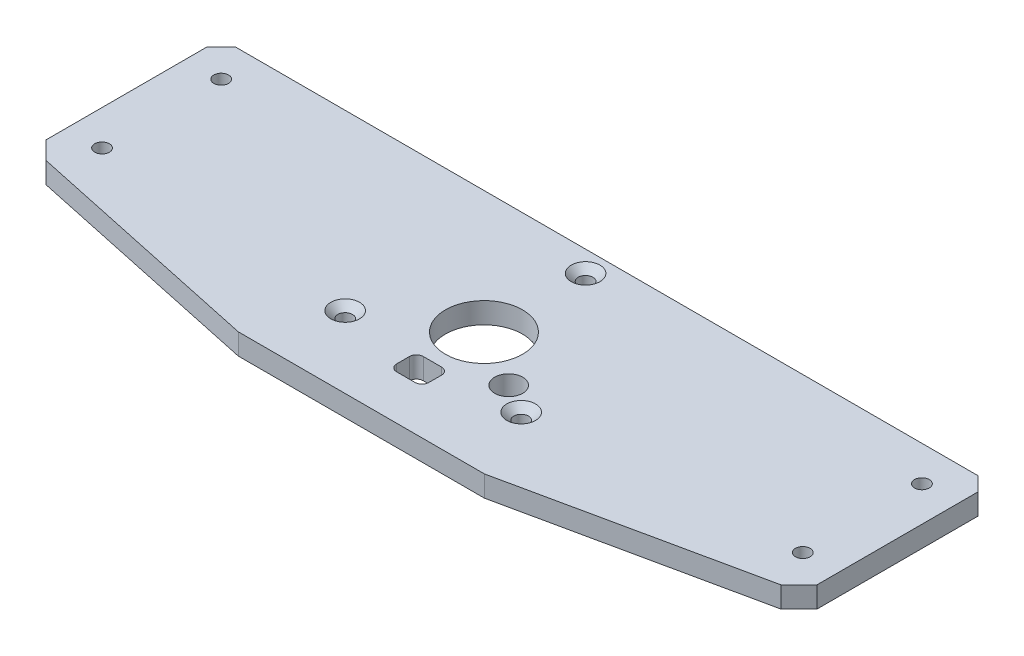
ISO-10303-21;
HEADER;
FILE_DESCRIPTION(('STEP AP214'),'2;1');
FILE_NAME('part.step','',(''),(''),'','','');
FILE_SCHEMA(('AUTOMOTIVE_DESIGN { 1 0 10303 214 1 1 1 1 }'));
ENDSEC;
DATA;
#1=APPLICATION_CONTEXT('core data for automotive mechanical design processes');
#2=APPLICATION_PROTOCOL_DEFINITION('international standard','automotive_design',2000,#1);
#3=PRODUCT_CONTEXT('',#1,'mechanical');
#4=PRODUCT('Part','Part','',(#3));
#5=PRODUCT_RELATED_PRODUCT_CATEGORY('part','',(#4));
#6=PRODUCT_DEFINITION_FORMATION('','',#4);
#7=PRODUCT_DEFINITION_CONTEXT('part definition',#1,'design');
#8=PRODUCT_DEFINITION('design','',#6,#7);
#9=PRODUCT_DEFINITION_SHAPE('','',#8);
#10=(LENGTH_UNIT() NAMED_UNIT(*) SI_UNIT(.MILLI.,.METRE.));
#11=(NAMED_UNIT(*) PLANE_ANGLE_UNIT() SI_UNIT($,.RADIAN.));
#12=(NAMED_UNIT(*) SI_UNIT($,.STERADIAN.) SOLID_ANGLE_UNIT());
#13=UNCERTAINTY_MEASURE_WITH_UNIT(LENGTH_MEASURE(1.E-05),#10,'distance_accuracy_value','');
#14=(GEOMETRIC_REPRESENTATION_CONTEXT(3) GLOBAL_UNCERTAINTY_ASSIGNED_CONTEXT((#13)) GLOBAL_UNIT_ASSIGNED_CONTEXT((#10,
#11,#12)) REPRESENTATION_CONTEXT('',''));
#15=CARTESIAN_POINT('',(0.,0.,0.));
#16=DIRECTION('',(0.,0.,1.));
#17=DIRECTION('',(1.,0.,0.));
#18=AXIS2_PLACEMENT_3D('',#15,#16,#17);
#19=CARTESIAN_POINT('',(0.,3.,0.));
#20=DIRECTION('',(0.,1.,0.));
#21=DIRECTION('',(0.,0.,1.));
#22=AXIS2_PLACEMENT_3D('',#19,#20,#21);
#23=PLANE('',#22);
#24=DIRECTION('',(-0.977927565525987,0.,0.208944194904804));
#25=VECTOR('',#24,1.);
#26=CARTESIAN_POINT('',(110.,3.,19.));
#27=LINE('',#26,#25);
#28=CARTESIAN_POINT('',(104.91314063275,3.,20.0868593672501));
#29=VERTEX_POINT('',#28);
#30=CARTESIAN_POINT('',(35.1147367097487,3.,35.));
#31=VERTEX_POINT('',#30);
#32=EDGE_CURVE('E287',#29,#31,#27,.T.);
#33=ORIENTED_EDGE('',*,*,#32,.F.);
#34=DIRECTION('',(-0.707106781186545,0.,0.70710678118655));
#35=VECTOR('',#34,1.);
#36=CARTESIAN_POINT('',(62.5000000000003,3.,62.5));
#37=LINE('',#36,#35);
#38=CARTESIAN_POINT('',(110.,3.,15.));
#39=VERTEX_POINT('',#38);
#40=EDGE_CURVE('E237',#29,#39,#37,.F.);
#41=ORIENTED_EDGE('',*,*,#40,.T.);
#42=DIRECTION('',(0.,0.,-1.));
#43=VECTOR('',#42,1.);
#44=CARTESIAN_POINT('',(110.,3.,35.));
#45=LINE('',#44,#43);
#46=CARTESIAN_POINT('',(110.,3.,-31.));
#47=VERTEX_POINT('',#46);
#48=EDGE_CURVE('E189',#39,#47,#45,.T.);
#49=ORIENTED_EDGE('',*,*,#48,.T.);
#50=DIRECTION('',(0.707106781186548,0.,0.707106781186548));
#51=VECTOR('',#50,1.);
#52=CARTESIAN_POINT('',(70.5,3.,-70.5));
#53=LINE('',#52,#51);
#54=CARTESIAN_POINT('',(106.,3.,-35.));
#55=VERTEX_POINT('',#54);
#56=EDGE_CURVE('E235',#47,#55,#53,.F.);
#57=ORIENTED_EDGE('',*,*,#56,.T.);
#58=DIRECTION('',(-1.,0.,0.));
#59=VECTOR('',#58,1.);
#60=CARTESIAN_POINT('',(110.,3.,-35.));
#61=LINE('',#60,#59);
#62=CARTESIAN_POINT('',(-106.,3.,-35.));
#63=VERTEX_POINT('',#62);
#64=EDGE_CURVE('E193',#55,#63,#61,.T.);
#65=ORIENTED_EDGE('',*,*,#64,.T.);
#66=DIRECTION('',(0.707106781186544,0.,-0.707106781186551));
#67=VECTOR('',#66,1.);
#68=CARTESIAN_POINT('',(-70.5000000000005,3.,-70.4999999999999));
#69=LINE('',#68,#67);
#70=CARTESIAN_POINT('',(-110.,3.,-31.));
#71=VERTEX_POINT('',#70);
#72=EDGE_CURVE('E233',#63,#71,#69,.F.);
#73=ORIENTED_EDGE('',*,*,#72,.T.);
#74=DIRECTION('',(0.,0.,1.));
#75=VECTOR('',#74,1.);
#76=CARTESIAN_POINT('',(-110.,3.,35.));
#77=LINE('',#76,#75);
#78=CARTESIAN_POINT('',(-110.,3.,15.));
#79=VERTEX_POINT('',#78);
#80=EDGE_CURVE('E190',#71,#79,#77,.T.);
#81=ORIENTED_EDGE('',*,*,#80,.T.);
#82=DIRECTION('',(-0.707106781186545,0.,-0.70710678118655));
#83=VECTOR('',#82,1.);
#84=CARTESIAN_POINT('',(-62.5000000000003,3.,62.5));
#85=LINE('',#84,#83);
#86=CARTESIAN_POINT('',(-104.91314063275,3.,20.0868593672501));
#87=VERTEX_POINT('',#86);
#88=EDGE_CURVE('E183',#79,#87,#85,.F.);
#89=ORIENTED_EDGE('',*,*,#88,.T.);
#90=DIRECTION('',(-0.977927565525987,0.,-0.208944194904804));
#91=VECTOR('',#90,1.);
#92=CARTESIAN_POINT('',(-110.,3.,19.));
#93=LINE('',#92,#91);
#94=CARTESIAN_POINT('',(-35.1147367097487,3.,35.));
#95=VERTEX_POINT('',#94);
#96=EDGE_CURVE('E167',#95,#87,#93,.T.);
#97=ORIENTED_EDGE('',*,*,#96,.F.);
#98=DIRECTION('',(1.,0.,0.));
#99=VECTOR('',#98,1.);
#100=CARTESIAN_POINT('',(110.,3.,35.));
#101=LINE('',#100,#99);
#102=EDGE_CURVE('E181',#95,#31,#101,.T.);
#103=ORIENTED_EDGE('',*,*,#102,.T.);
#104=EDGE_LOOP('',(#33,#41,#49,#57,#65,#73,#81,#89,#97,#103));
#105=FACE_BOUND('',#104,.T.);
#106=CARTESIAN_POINT('',(25.1147367097487,3.,14.5));
#107=DIRECTION('',(0.,1.,0.));
#108=DIRECTION('',(0.,0.,1.));
#109=AXIS2_PLACEMENT_3D('',#106,#107,#108);
#110=CIRCLE('',#109,4.10000000000002);
#111=CARTESIAN_POINT('',(25.1147367097487,3.,18.6));
#112=VERTEX_POINT('',#111);
#113=EDGE_CURVE('E220',#112,#112,#110,.F.);
#114=ORIENTED_EDGE('',*,*,#113,.T.);
#115=EDGE_LOOP('',(#114));
#116=FACE_BOUND('',#115,.T.);
#117=CARTESIAN_POINT('',(-25.1147367097487,3.,14.5));
#118=DIRECTION('',(0.,1.,0.));
#119=DIRECTION('',(0.,0.,1.));
#120=AXIS2_PLACEMENT_3D('',#117,#118,#119);
#121=CIRCLE('',#120,4.09999999999997);
#122=CARTESIAN_POINT('',(-25.1147367097487,3.,18.5999999999999));
#123=VERTEX_POINT('',#122);
#124=EDGE_CURVE('E217',#123,#123,#121,.F.);
#125=ORIENTED_EDGE('',*,*,#124,.T.);
#126=EDGE_LOOP('',(#125));
#127=FACE_BOUND('',#126,.T.);
#128=CARTESIAN_POINT('',(0.,3.,-29.));
#129=DIRECTION('',(0.,1.,0.));
#130=DIRECTION('',(0.,0.,1.));
#131=AXIS2_PLACEMENT_3D('',#128,#129,#130);
#132=CIRCLE('',#131,4.10000000000002);
#133=CARTESIAN_POINT('',(0.,3.,-24.9));
#134=VERTEX_POINT('',#133);
#135=EDGE_CURVE('E214',#134,#134,#132,.F.);
#136=ORIENTED_EDGE('',*,*,#135,.T.);
#137=EDGE_LOOP('',(#136));
#138=FACE_BOUND('',#137,.T.);
#139=CARTESIAN_POINT('',(-2.6,3.,20.3));
#140=DIRECTION('',(0.,1.,0.));
#141=DIRECTION('',(0.,0.,1.));
#142=AXIS2_PLACEMENT_3D('',#139,#140,#141);
#143=CIRCLE('',#142,2.);
#144=CARTESIAN_POINT('',(-4.6,3.,20.3));
#145=VERTEX_POINT('',#144);
#146=CARTESIAN_POINT('',(-2.59999999999998,3.,22.3));
#147=VERTEX_POINT('',#146);
#148=EDGE_CURVE('E175',#145,#147,#143,.T.);
#149=ORIENTED_EDGE('',*,*,#148,.F.);
#150=DIRECTION('',(0.,0.,1.));
#151=VECTOR('',#150,1.);
#152=CARTESIAN_POINT('',(-4.6,3.,20.3));
#153=LINE('',#152,#151);
#154=CARTESIAN_POINT('',(-4.6,3.,16.7));
#155=VERTEX_POINT('',#154);
#156=EDGE_CURVE('E296',#155,#145,#153,.T.);
#157=ORIENTED_EDGE('',*,*,#156,.F.);
#158=CARTESIAN_POINT('',(-2.6,3.,16.7));
#159=DIRECTION('',(0.,1.,0.));
#160=DIRECTION('',(0.,0.,1.));
#161=AXIS2_PLACEMENT_3D('',#158,#159,#160);
#162=CIRCLE('',#161,2.);
#163=CARTESIAN_POINT('',(-2.59999999999998,3.,14.7));
#164=VERTEX_POINT('',#163);
#165=EDGE_CURVE('E334',#164,#155,#162,.T.);
#166=ORIENTED_EDGE('',*,*,#165,.F.);
#167=DIRECTION('',(-1.,0.,0.));
#168=VECTOR('',#167,1.);
#169=CARTESIAN_POINT('',(2.59999999999999,3.,14.7));
#170=LINE('',#169,#168);
#171=CARTESIAN_POINT('',(2.59999999999999,3.,14.7));
#172=VERTEX_POINT('',#171);
#173=EDGE_CURVE('E331',#172,#164,#170,.T.);
#174=ORIENTED_EDGE('',*,*,#173,.F.);
#175=CARTESIAN_POINT('',(2.6,3.,16.7));
#176=DIRECTION('',(0.,1.,0.));
#177=DIRECTION('',(0.,0.,1.));
#178=AXIS2_PLACEMENT_3D('',#175,#176,#177);
#179=CIRCLE('',#178,2.);
#180=CARTESIAN_POINT('',(4.6,3.,16.7));
#181=VERTEX_POINT('',#180);
#182=EDGE_CURVE('E328',#181,#172,#179,.T.);
#183=ORIENTED_EDGE('',*,*,#182,.F.);
#184=DIRECTION('',(0.,0.,-1.));
#185=VECTOR('',#184,1.);
#186=CARTESIAN_POINT('',(4.6,3.,20.3));
#187=LINE('',#186,#185);
#188=CARTESIAN_POINT('',(4.6,3.,20.3));
#189=VERTEX_POINT('',#188);
#190=EDGE_CURVE('E325',#189,#181,#187,.T.);
#191=ORIENTED_EDGE('',*,*,#190,.F.);
#192=CARTESIAN_POINT('',(2.6,3.,20.3));
#193=DIRECTION('',(0.,1.,0.));
#194=DIRECTION('',(0.,0.,-1.));
#195=AXIS2_PLACEMENT_3D('',#192,#193,#194);
#196=CIRCLE('',#195,2.);
#197=CARTESIAN_POINT('',(2.59999999999999,3.,22.3));
#198=VERTEX_POINT('',#197);
#199=EDGE_CURVE('E322',#198,#189,#196,.T.);
#200=ORIENTED_EDGE('',*,*,#199,.F.);
#201=DIRECTION('',(1.,0.,0.));
#202=VECTOR('',#201,1.);
#203=CARTESIAN_POINT('',(2.59999999999999,3.,22.3));
#204=LINE('',#203,#202);
#205=EDGE_CURVE('E319',#147,#198,#204,.T.);
#206=ORIENTED_EDGE('',*,*,#205,.F.);
#207=EDGE_LOOP('',(#149,#157,#166,#174,#183,#191,#200,#206));
#208=FACE_BOUND('',#207,.T.);
#209=CARTESIAN_POINT('',(16.6709890228505,3.,9.62499999999999));
#210=DIRECTION('',(0.,1.,0.));
#211=DIRECTION('',(0.,0.,1.));
#212=AXIS2_PLACEMENT_3D('',#209,#210,#211);
#213=CIRCLE('',#212,4.);
#214=CARTESIAN_POINT('',(16.6709890228505,3.,13.625));
#215=VERTEX_POINT('',#214);
#216=EDGE_CURVE('E341',#215,#215,#213,.T.);
#217=ORIENTED_EDGE('',*,*,#216,.F.);
#218=EDGE_LOOP('',(#217));
#219=FACE_BOUND('',#218,.T.);
#220=CARTESIAN_POINT('',(100.,3.,8.99999999999999));
#221=DIRECTION('',(0.,1.,0.));
#222=DIRECTION('',(0.,0.,1.));
#223=AXIS2_PLACEMENT_3D('',#220,#221,#222);
#224=CIRCLE('',#223,2.1);
#225=CARTESIAN_POINT('',(100.,3.,11.1));
#226=VERTEX_POINT('',#225);
#227=EDGE_CURVE('E374',#226,#226,#224,.T.);
#228=ORIENTED_EDGE('',*,*,#227,.F.);
#229=EDGE_LOOP('',(#228));
#230=FACE_BOUND('',#229,.T.);
#231=CARTESIAN_POINT('',(-100.,3.,-25.));
#232=DIRECTION('',(0.,1.,0.));
#233=DIRECTION('',(0.,0.,1.));
#234=AXIS2_PLACEMENT_3D('',#231,#232,#233);
#235=CIRCLE('',#234,2.1);
#236=CARTESIAN_POINT('',(-100.,3.,-22.9));
#237=VERTEX_POINT('',#236);
#238=EDGE_CURVE('E206',#237,#237,#235,.T.);
#239=ORIENTED_EDGE('',*,*,#238,.F.);
#240=EDGE_LOOP('',(#239));
#241=FACE_BOUND('',#240,.T.);
#242=CARTESIAN_POINT('',(100.,3.,-25.));
#243=DIRECTION('',(0.,1.,0.));
#244=DIRECTION('',(0.,0.,1.));
#245=AXIS2_PLACEMENT_3D('',#242,#243,#244);
#246=CIRCLE('',#245,2.1);
#247=CARTESIAN_POINT('',(100.,3.,-22.9));
#248=VERTEX_POINT('',#247);
#249=EDGE_CURVE('E389',#248,#248,#246,.T.);
#250=ORIENTED_EDGE('',*,*,#249,.F.);
#251=EDGE_LOOP('',(#250));
#252=FACE_BOUND('',#251,.T.);
#253=CARTESIAN_POINT('',(-100.,3.,8.99999999999999));
#254=DIRECTION('',(0.,1.,0.));
#255=DIRECTION('',(0.,0.,1.));
#256=AXIS2_PLACEMENT_3D('',#253,#254,#255);
#257=CIRCLE('',#256,2.1);
#258=CARTESIAN_POINT('',(-100.,3.,11.1));
#259=VERTEX_POINT('',#258);
#260=EDGE_CURVE('E380',#259,#259,#257,.T.);
#261=ORIENTED_EDGE('',*,*,#260,.F.);
#262=EDGE_LOOP('',(#261));
#263=FACE_BOUND('',#262,.T.);
#264=CARTESIAN_POINT('',(0.,3.,0.));
#265=DIRECTION('',(0.,1.,0.));
#266=DIRECTION('',(0.,0.,1.));
#267=AXIS2_PLACEMENT_3D('',#264,#265,#266);
#268=CIRCLE('',#267,11.);
#269=CARTESIAN_POINT('',(0.,3.,11.));
#270=VERTEX_POINT('',#269);
#271=EDGE_CURVE('E368',#270,#270,#268,.T.);
#272=ORIENTED_EDGE('',*,*,#271,.F.);
#273=EDGE_LOOP('',(#272));
#274=FACE_BOUND('',#273,.T.);
#275=ADVANCED_FACE('F37',(#105,#116,#127,#138,#208,#219,#230,#241,#252,#263,#274),#23,.T.);
#276=CARTESIAN_POINT('',(0.,-3.,0.));
#277=DIRECTION('',(0.,1.,0.));
#278=DIRECTION('',(0.,0.,1.));
#279=AXIS2_PLACEMENT_3D('',#276,#277,#278);
#280=PLANE('',#279);
#281=DIRECTION('',(0.,0.,1.));
#282=VECTOR('',#281,1.);
#283=CARTESIAN_POINT('',(-4.6,-3.,20.3));
#284=LINE('',#283,#282);
#285=CARTESIAN_POINT('',(-4.6,-3.,16.7));
#286=VERTEX_POINT('',#285);
#287=CARTESIAN_POINT('',(-4.6,-3.,20.3));
#288=VERTEX_POINT('',#287);
#289=EDGE_CURVE('E314',#286,#288,#284,.T.);
#290=ORIENTED_EDGE('',*,*,#289,.T.);
#291=CARTESIAN_POINT('',(-2.6,-3.,20.3));
#292=DIRECTION('',(0.,1.,0.));
#293=DIRECTION('',(0.,0.,1.));
#294=AXIS2_PLACEMENT_3D('',#291,#292,#293);
#295=CIRCLE('',#294,2.);
#296=CARTESIAN_POINT('',(-2.59999999999998,-3.,22.3));
#297=VERTEX_POINT('',#296);
#298=EDGE_CURVE('E292',#288,#297,#295,.T.);
#299=ORIENTED_EDGE('',*,*,#298,.T.);
#300=DIRECTION('',(1.,0.,0.));
#301=VECTOR('',#300,1.);
#302=CARTESIAN_POINT('',(2.59999999999999,-3.,22.3));
#303=LINE('',#302,#301);
#304=CARTESIAN_POINT('',(2.59999999999999,-3.,22.3));
#305=VERTEX_POINT('',#304);
#306=EDGE_CURVE('E295',#297,#305,#303,.T.);
#307=ORIENTED_EDGE('',*,*,#306,.T.);
#308=CARTESIAN_POINT('',(2.6,-3.,20.3));
#309=DIRECTION('',(0.,1.,0.));
#310=DIRECTION('',(0.,0.,-1.));
#311=AXIS2_PLACEMENT_3D('',#308,#309,#310);
#312=CIRCLE('',#311,2.);
#313=CARTESIAN_POINT('',(4.6,-3.,20.3));
#314=VERTEX_POINT('',#313);
#315=EDGE_CURVE('E299',#305,#314,#312,.T.);
#316=ORIENTED_EDGE('',*,*,#315,.T.);
#317=DIRECTION('',(0.,0.,-1.));
#318=VECTOR('',#317,1.);
#319=CARTESIAN_POINT('',(4.6,-3.,20.3));
#320=LINE('',#319,#318);
#321=CARTESIAN_POINT('',(4.6,-3.,16.7));
#322=VERTEX_POINT('',#321);
#323=EDGE_CURVE('E302',#314,#322,#320,.T.);
#324=ORIENTED_EDGE('',*,*,#323,.T.);
#325=CARTESIAN_POINT('',(2.6,-3.,16.7));
#326=DIRECTION('',(0.,1.,0.));
#327=DIRECTION('',(0.,0.,1.));
#328=AXIS2_PLACEMENT_3D('',#325,#326,#327);
#329=CIRCLE('',#328,2.);
#330=CARTESIAN_POINT('',(2.59999999999999,-3.,14.7));
#331=VERTEX_POINT('',#330);
#332=EDGE_CURVE('E305',#322,#331,#329,.T.);
#333=ORIENTED_EDGE('',*,*,#332,.T.);
#334=DIRECTION('',(-1.,0.,0.));
#335=VECTOR('',#334,1.);
#336=CARTESIAN_POINT('',(2.59999999999999,-3.,14.7));
#337=LINE('',#336,#335);
#338=CARTESIAN_POINT('',(-2.59999999999998,-3.,14.7));
#339=VERTEX_POINT('',#338);
#340=EDGE_CURVE('E308',#331,#339,#337,.T.);
#341=ORIENTED_EDGE('',*,*,#340,.T.);
#342=CARTESIAN_POINT('',(-2.6,-3.,16.7));
#343=DIRECTION('',(0.,1.,0.));
#344=DIRECTION('',(0.,0.,1.));
#345=AXIS2_PLACEMENT_3D('',#342,#343,#344);
#346=CIRCLE('',#345,2.);
#347=EDGE_CURVE('E311',#339,#286,#346,.T.);
#348=ORIENTED_EDGE('',*,*,#347,.T.);
#349=EDGE_LOOP('',(#290,#299,#307,#316,#324,#333,#341,#348));
#350=FACE_BOUND('',#349,.T.);
#351=CARTESIAN_POINT('',(16.6709890228505,-3.,9.62499999999999));
#352=DIRECTION('',(0.,1.,0.));
#353=DIRECTION('',(0.,0.,1.));
#354=AXIS2_PLACEMENT_3D('',#351,#352,#353);
#355=CIRCLE('',#354,4.);
#356=CARTESIAN_POINT('',(16.6709890228505,-3.,13.625));
#357=VERTEX_POINT('',#356);
#358=EDGE_CURVE('E356',#357,#357,#355,.T.);
#359=ORIENTED_EDGE('',*,*,#358,.T.);
#360=EDGE_LOOP('',(#359));
#361=FACE_BOUND('',#360,.T.);
#362=DIRECTION('',(0.,0.,-1.));
#363=VECTOR('',#362,1.);
#364=CARTESIAN_POINT('',(110.,-3.,35.));
#365=LINE('',#364,#363);
#366=CARTESIAN_POINT('',(110.,-3.,15.));
#367=VERTEX_POINT('',#366);
#368=CARTESIAN_POINT('',(110.,-3.,-31.));
#369=VERTEX_POINT('',#368);
#370=EDGE_CURVE('E208',#367,#369,#365,.T.);
#371=ORIENTED_EDGE('',*,*,#370,.F.);
#372=DIRECTION('',(0.707106781186545,0.,-0.70710678118655));
#373=VECTOR('',#372,1.);
#374=CARTESIAN_POINT('',(104.91314063275,-3.,20.0868593672501));
#375=LINE('',#374,#373);
#376=CARTESIAN_POINT('',(104.91314063275,-3.,20.0868593672501));
#377=VERTEX_POINT('',#376);
#378=EDGE_CURVE('E247',#367,#377,#375,.F.);
#379=ORIENTED_EDGE('',*,*,#378,.T.);
#380=DIRECTION('',(-0.977927565525987,0.,0.208944194904804));
#381=VECTOR('',#380,1.);
#382=CARTESIAN_POINT('',(110.,-3.,19.));
#383=LINE('',#382,#381);
#384=CARTESIAN_POINT('',(35.1147367097487,-3.,35.));
#385=VERTEX_POINT('',#384);
#386=EDGE_CURVE('E284',#377,#385,#383,.T.);
#387=ORIENTED_EDGE('',*,*,#386,.T.);
#388=DIRECTION('',(1.,0.,0.));
#389=VECTOR('',#388,1.);
#390=CARTESIAN_POINT('',(110.,-3.,35.));
#391=LINE('',#390,#389);
#392=CARTESIAN_POINT('',(-35.1147367097487,-3.,35.));
#393=VERTEX_POINT('',#392);
#394=EDGE_CURVE('E205',#393,#385,#391,.T.);
#395=ORIENTED_EDGE('',*,*,#394,.F.);
#396=DIRECTION('',(-0.977927565525987,0.,-0.208944194904804));
#397=VECTOR('',#396,1.);
#398=CARTESIAN_POINT('',(-110.,-3.,19.));
#399=LINE('',#398,#397);
#400=CARTESIAN_POINT('',(-104.91314063275,-3.,20.0868593672501));
#401=VERTEX_POINT('',#400);
#402=EDGE_CURVE('E170',#393,#401,#399,.T.);
#403=ORIENTED_EDGE('',*,*,#402,.T.);
#404=DIRECTION('',(0.707106781186545,0.,0.70710678118655));
#405=VECTOR('',#404,1.);
#406=CARTESIAN_POINT('',(-110.,-3.,15.));
#407=LINE('',#406,#405);
#408=CARTESIAN_POINT('',(-110.,-3.,15.));
#409=VERTEX_POINT('',#408);
#410=EDGE_CURVE('E243',#401,#409,#407,.F.);
#411=ORIENTED_EDGE('',*,*,#410,.T.);
#412=DIRECTION('',(0.,0.,1.));
#413=VECTOR('',#412,1.);
#414=CARTESIAN_POINT('',(-110.,-3.,35.));
#415=LINE('',#414,#413);
#416=CARTESIAN_POINT('',(-110.,-3.,-31.));
#417=VERTEX_POINT('',#416);
#418=EDGE_CURVE('E202',#417,#409,#415,.T.);
#419=ORIENTED_EDGE('',*,*,#418,.F.);
#420=DIRECTION('',(-0.707106781186544,0.,0.707106781186551));
#421=VECTOR('',#420,1.);
#422=CARTESIAN_POINT('',(-110.,-3.,-31.));
#423=LINE('',#422,#421);
#424=CARTESIAN_POINT('',(-106.,-3.,-35.));
#425=VERTEX_POINT('',#424);
#426=EDGE_CURVE('E53',#417,#425,#423,.F.);
#427=ORIENTED_EDGE('',*,*,#426,.T.);
#428=DIRECTION('',(-1.,0.,0.));
#429=VECTOR('',#428,1.);
#430=CARTESIAN_POINT('',(110.,-3.,-35.));
#431=LINE('',#430,#429);
#432=CARTESIAN_POINT('',(106.,-3.,-35.));
#433=VERTEX_POINT('',#432);
#434=EDGE_CURVE('E195',#433,#425,#431,.T.);
#435=ORIENTED_EDGE('',*,*,#434,.F.);
#436=DIRECTION('',(-0.707106781186548,0.,-0.707106781186548));
#437=VECTOR('',#436,1.);
#438=CARTESIAN_POINT('',(106.,-3.,-35.));
#439=LINE('',#438,#437);
#440=EDGE_CURVE('E61',#433,#369,#439,.F.);
#441=ORIENTED_EDGE('',*,*,#440,.T.);
#442=EDGE_LOOP('',(#371,#379,#387,#395,#403,#411,#419,#427,#435,#441));
#443=FACE_BOUND('',#442,.T.);
#444=CARTESIAN_POINT('',(-100.,-3.,-25.));
#445=DIRECTION('',(0.,1.,0.));
#446=DIRECTION('',(0.,0.,1.));
#447=AXIS2_PLACEMENT_3D('',#444,#445,#446);
#448=CIRCLE('',#447,2.1);
#449=CARTESIAN_POINT('',(-100.,-3.,-22.9));
#450=VERTEX_POINT('',#449);
#451=EDGE_CURVE('E392',#450,#450,#448,.T.);
#452=ORIENTED_EDGE('',*,*,#451,.T.);
#453=EDGE_LOOP('',(#452));
#454=FACE_BOUND('',#453,.T.);
#455=CARTESIAN_POINT('',(100.,-3.,-25.));
#456=DIRECTION('',(0.,1.,0.));
#457=DIRECTION('',(0.,0.,1.));
#458=AXIS2_PLACEMENT_3D('',#455,#456,#457);
#459=CIRCLE('',#458,2.1);
#460=CARTESIAN_POINT('',(100.,-3.,-22.9));
#461=VERTEX_POINT('',#460);
#462=EDGE_CURVE('E388',#461,#461,#459,.T.);
#463=ORIENTED_EDGE('',*,*,#462,.T.);
#464=EDGE_LOOP('',(#463));
#465=FACE_BOUND('',#464,.T.);
#466=CARTESIAN_POINT('',(0.,-3.,-29.));
#467=DIRECTION('',(0.,1.,0.));
#468=DIRECTION('',(0.,0.,1.));
#469=AXIS2_PLACEMENT_3D('',#466,#467,#468);
#470=CIRCLE('',#469,2.1);
#471=CARTESIAN_POINT('',(0.,-3.,-26.9));
#472=VERTEX_POINT('',#471);
#473=EDGE_CURVE('E383',#472,#472,#470,.T.);
#474=ORIENTED_EDGE('',*,*,#473,.T.);
#475=EDGE_LOOP('',(#474));
#476=FACE_BOUND('',#475,.T.);
#477=CARTESIAN_POINT('',(-100.,-3.,8.99999999999999));
#478=DIRECTION('',(0.,1.,0.));
#479=DIRECTION('',(0.,0.,1.));
#480=AXIS2_PLACEMENT_3D('',#477,#478,#479);
#481=CIRCLE('',#480,2.1);
#482=CARTESIAN_POINT('',(-100.,-3.,11.1));
#483=VERTEX_POINT('',#482);
#484=EDGE_CURVE('E377',#483,#483,#481,.T.);
#485=ORIENTED_EDGE('',*,*,#484,.T.);
#486=EDGE_LOOP('',(#485));
#487=FACE_BOUND('',#486,.T.);
#488=CARTESIAN_POINT('',(100.,-3.,8.99999999999999));
#489=DIRECTION('',(0.,1.,0.));
#490=DIRECTION('',(0.,0.,1.));
#491=AXIS2_PLACEMENT_3D('',#488,#489,#490);
#492=CIRCLE('',#491,2.1);
#493=CARTESIAN_POINT('',(100.,-3.,11.1));
#494=VERTEX_POINT('',#493);
#495=EDGE_CURVE('E371',#494,#494,#492,.T.);
#496=ORIENTED_EDGE('',*,*,#495,.T.);
#497=EDGE_LOOP('',(#496));
#498=FACE_BOUND('',#497,.T.);
#499=CARTESIAN_POINT('',(0.,-3.,0.));
#500=DIRECTION('',(0.,1.,0.));
#501=DIRECTION('',(0.,0.,1.));
#502=AXIS2_PLACEMENT_3D('',#499,#500,#501);
#503=CIRCLE('',#502,11.);
#504=CARTESIAN_POINT('',(0.,-3.,11.));
#505=VERTEX_POINT('',#504);
#506=EDGE_CURVE('E367',#505,#505,#503,.T.);
#507=ORIENTED_EDGE('',*,*,#506,.T.);
#508=EDGE_LOOP('',(#507));
#509=FACE_BOUND('',#508,.T.);
#510=CARTESIAN_POINT('',(25.1147367097487,-3.,14.5));
#511=DIRECTION('',(0.,1.,0.));
#512=DIRECTION('',(0.,0.,1.));
#513=AXIS2_PLACEMENT_3D('',#510,#511,#512);
#514=CIRCLE('',#513,2.1);
#515=CARTESIAN_POINT('',(25.1147367097487,-3.,16.6));
#516=VERTEX_POINT('',#515);
#517=EDGE_CURVE('E364',#516,#516,#514,.T.);
#518=ORIENTED_EDGE('',*,*,#517,.T.);
#519=EDGE_LOOP('',(#518));
#520=FACE_BOUND('',#519,.T.);
#521=CARTESIAN_POINT('',(-25.1147367097487,-3.,14.5));
#522=DIRECTION('',(0.,1.,0.));
#523=DIRECTION('',(0.,0.,1.));
#524=AXIS2_PLACEMENT_3D('',#521,#522,#523);
#525=CIRCLE('',#524,2.1);
#526=CARTESIAN_POINT('',(-25.1147367097487,-3.,16.6));
#527=VERTEX_POINT('',#526);
#528=EDGE_CURVE('E359',#527,#527,#525,.T.);
#529=ORIENTED_EDGE('',*,*,#528,.T.);
#530=EDGE_LOOP('',(#529));
#531=FACE_BOUND('',#530,.T.);
#532=ADVANCED_FACE('F264',(#350,#361,#443,#454,#465,#476,#487,#498,#509,#520,#531),#280,.F.);
#533=CARTESIAN_POINT('',(-110.,3.,35.));
#534=DIRECTION('',(1.,0.,0.));
#535=DIRECTION('',(0.,0.,-1.));
#536=AXIS2_PLACEMENT_3D('',#533,#534,#535);
#537=PLANE('',#536);
#538=ORIENTED_EDGE('',*,*,#80,.F.);
#539=DIRECTION('',(0.,-1.,0.));
#540=VECTOR('',#539,1.);
#541=CARTESIAN_POINT('',(-110.,3.,-31.));
#542=LINE('',#541,#540);
#543=EDGE_CURVE('E46',#71,#417,#542,.T.);
#544=ORIENTED_EDGE('',*,*,#543,.T.);
#545=ORIENTED_EDGE('',*,*,#418,.T.);
#546=DIRECTION('',(0.,1.,0.));
#547=VECTOR('',#546,1.);
#548=CARTESIAN_POINT('',(-110.,3.,15.));
#549=LINE('',#548,#547);
#550=EDGE_CURVE('E253',#409,#79,#549,.T.);
#551=ORIENTED_EDGE('',*,*,#550,.T.);
#552=EDGE_LOOP('',(#538,#544,#545,#551));
#553=FACE_BOUND('',#552,.T.);
#554=ADVANCED_FACE('F259',(#553),#537,.F.);
#555=CARTESIAN_POINT('',(110.,3.,35.));
#556=DIRECTION('',(0.,0.,-1.));
#557=DIRECTION('',(-1.,0.,0.));
#558=AXIS2_PLACEMENT_3D('',#555,#556,#557);
#559=PLANE('',#558);
#560=ORIENTED_EDGE('',*,*,#102,.F.);
#561=DIRECTION('',(0.,1.,0.));
#562=VECTOR('',#561,1.);
#563=CARTESIAN_POINT('',(-35.1147367097487,-3.,35.));
#564=LINE('',#563,#562);
#565=EDGE_CURVE('E164',#393,#95,#564,.T.);
#566=ORIENTED_EDGE('',*,*,#565,.F.);
#567=ORIENTED_EDGE('',*,*,#394,.T.);
#568=DIRECTION('',(0.,1.,0.));
#569=VECTOR('',#568,1.);
#570=CARTESIAN_POINT('',(35.1147367097487,-3.,35.));
#571=LINE('',#570,#569);
#572=EDGE_CURVE('E184',#385,#31,#571,.T.);
#573=ORIENTED_EDGE('',*,*,#572,.T.);
#574=EDGE_LOOP('',(#560,#566,#567,#573));
#575=FACE_BOUND('',#574,.T.);
#576=ADVANCED_FACE('F187',(#575),#559,.F.);
#577=CARTESIAN_POINT('',(110.,3.,35.));
#578=DIRECTION('',(-1.,0.,0.));
#579=DIRECTION('',(0.,0.,1.));
#580=AXIS2_PLACEMENT_3D('',#577,#578,#579);
#581=PLANE('',#580);
#582=ORIENTED_EDGE('',*,*,#48,.F.);
#583=DIRECTION('',(0.,-1.,0.));
#584=VECTOR('',#583,1.);
#585=CARTESIAN_POINT('',(110.,3.,15.));
#586=LINE('',#585,#584);
#587=EDGE_CURVE('E241',#39,#367,#586,.T.);
#588=ORIENTED_EDGE('',*,*,#587,.T.);
#589=ORIENTED_EDGE('',*,*,#370,.T.);
#590=DIRECTION('',(0.,1.,0.));
#591=VECTOR('',#590,1.);
#592=CARTESIAN_POINT('',(110.,3.,-31.));
#593=LINE('',#592,#591);
#594=EDGE_CURVE('E239',#369,#47,#593,.T.);
#595=ORIENTED_EDGE('',*,*,#594,.T.);
#596=EDGE_LOOP('',(#582,#588,#589,#595));
#597=FACE_BOUND('',#596,.T.);
#598=ADVANCED_FACE('F276',(#597),#581,.F.);
#599=CARTESIAN_POINT('',(110.,3.,-35.));
#600=DIRECTION('',(0.,0.,1.));
#601=DIRECTION('',(1.,0.,0.));
#602=AXIS2_PLACEMENT_3D('',#599,#600,#601);
#603=PLANE('',#602);
#604=ORIENTED_EDGE('',*,*,#64,.F.);
#605=DIRECTION('',(0.,-1.,0.));
#606=VECTOR('',#605,1.);
#607=CARTESIAN_POINT('',(106.,3.,-35.));
#608=LINE('',#607,#606);
#609=EDGE_CURVE('E251',#55,#433,#608,.T.);
#610=ORIENTED_EDGE('',*,*,#609,.T.);
#611=ORIENTED_EDGE('',*,*,#434,.T.);
#612=DIRECTION('',(0.,1.,0.));
#613=VECTOR('',#612,1.);
#614=CARTESIAN_POINT('',(-106.,3.,-35.));
#615=LINE('',#614,#613);
#616=EDGE_CURVE('E249',#425,#63,#615,.T.);
#617=ORIENTED_EDGE('',*,*,#616,.T.);
#618=EDGE_LOOP('',(#604,#610,#611,#617));
#619=FACE_BOUND('',#618,.T.);
#620=ADVANCED_FACE('F272',(#619),#603,.F.);
#621=CARTESIAN_POINT('',(-100.,3.,-25.));
#622=DIRECTION('',(0.,-1.,0.));
#623=DIRECTION('',(0.,0.,-1.));
#624=AXIS2_PLACEMENT_3D('',#621,#622,#623);
#625=CYLINDRICAL_SURFACE('',#624,2.1);
#626=ORIENTED_EDGE('',*,*,#238,.T.);
#627=EDGE_LOOP('',(#626));
#628=FACE_BOUND('',#627,.T.);
#629=ORIENTED_EDGE('',*,*,#451,.F.);
#630=EDGE_LOOP('',(#629));
#631=FACE_BOUND('',#630,.T.);
#632=ADVANCED_FACE('F400',(#628,#631),#625,.F.);
#633=CARTESIAN_POINT('',(100.,3.,-25.));
#634=DIRECTION('',(0.,-1.,0.));
#635=DIRECTION('',(0.,0.,-1.));
#636=AXIS2_PLACEMENT_3D('',#633,#634,#635);
#637=CYLINDRICAL_SURFACE('',#636,2.1);
#638=ORIENTED_EDGE('',*,*,#249,.T.);
#639=EDGE_LOOP('',(#638));
#640=FACE_BOUND('',#639,.T.);
#641=ORIENTED_EDGE('',*,*,#462,.F.);
#642=EDGE_LOOP('',(#641));
#643=FACE_BOUND('',#642,.T.);
#644=ADVANCED_FACE('F402',(#640,#643),#637,.F.);
#645=CARTESIAN_POINT('',(0.,3.,-29.));
#646=DIRECTION('',(0.,-1.,0.));
#647=DIRECTION('',(0.,0.,-1.));
#648=AXIS2_PLACEMENT_3D('',#645,#646,#647);
#649=CYLINDRICAL_SURFACE('',#648,2.1);
#650=CARTESIAN_POINT('',(0.,0.999999999999972,-29.));
#651=DIRECTION('',(0.,1.,0.));
#652=DIRECTION('',(0.,0.,1.));
#653=AXIS2_PLACEMENT_3D('',#650,#651,#652);
#654=CIRCLE('',#653,2.1);
#655=CARTESIAN_POINT('',(0.,0.999999999999972,-26.9));
#656=VERTEX_POINT('',#655);
#657=EDGE_CURVE('E226',#656,#656,#654,.T.);
#658=ORIENTED_EDGE('',*,*,#657,.T.);
#659=EDGE_LOOP('',(#658));
#660=FACE_BOUND('',#659,.T.);
#661=ORIENTED_EDGE('',*,*,#473,.F.);
#662=EDGE_LOOP('',(#661));
#663=FACE_BOUND('',#662,.T.);
#664=ADVANCED_FACE('F409',(#660,#663),#649,.F.);
#665=CARTESIAN_POINT('',(-100.,3.,8.99999999999999));
#666=DIRECTION('',(0.,-1.,0.));
#667=DIRECTION('',(0.,0.,-1.));
#668=AXIS2_PLACEMENT_3D('',#665,#666,#667);
#669=CYLINDRICAL_SURFACE('',#668,2.1);
#670=ORIENTED_EDGE('',*,*,#260,.T.);
#671=EDGE_LOOP('',(#670));
#672=FACE_BOUND('',#671,.T.);
#673=ORIENTED_EDGE('',*,*,#484,.F.);
#674=EDGE_LOOP('',(#673));
#675=FACE_BOUND('',#674,.T.);
#676=ADVANCED_FACE('F589',(#672,#675),#669,.F.);
#677=CARTESIAN_POINT('',(100.,3.,8.99999999999999));
#678=DIRECTION('',(0.,-1.,0.));
#679=DIRECTION('',(0.,0.,-1.));
#680=AXIS2_PLACEMENT_3D('',#677,#678,#679);
#681=CYLINDRICAL_SURFACE('',#680,2.1);
#682=ORIENTED_EDGE('',*,*,#227,.T.);
#683=EDGE_LOOP('',(#682));
#684=FACE_BOUND('',#683,.T.);
#685=ORIENTED_EDGE('',*,*,#495,.F.);
#686=EDGE_LOOP('',(#685));
#687=FACE_BOUND('',#686,.T.);
#688=ADVANCED_FACE('F684',(#684,#687),#681,.F.);
#689=CARTESIAN_POINT('',(0.,3.,0.));
#690=DIRECTION('',(0.,-1.,0.));
#691=DIRECTION('',(0.,0.,-1.));
#692=AXIS2_PLACEMENT_3D('',#689,#690,#691);
#693=CYLINDRICAL_SURFACE('',#692,11.);
#694=ORIENTED_EDGE('',*,*,#271,.T.);
#695=EDGE_LOOP('',(#694));
#696=FACE_BOUND('',#695,.T.);
#697=ORIENTED_EDGE('',*,*,#506,.F.);
#698=EDGE_LOOP('',(#697));
#699=FACE_BOUND('',#698,.T.);
#700=ADVANCED_FACE('F577',(#696,#699),#693,.F.);
#701=CARTESIAN_POINT('',(25.1147367097487,3.,14.5));
#702=DIRECTION('',(0.,-1.,0.));
#703=DIRECTION('',(0.,0.,-1.));
#704=AXIS2_PLACEMENT_3D('',#701,#702,#703);
#705=CYLINDRICAL_SURFACE('',#704,2.1);
#706=CARTESIAN_POINT('',(25.1147367097487,0.999999999999969,14.5));
#707=DIRECTION('',(0.,1.,0.));
#708=DIRECTION('',(0.,0.,1.));
#709=AXIS2_PLACEMENT_3D('',#706,#707,#708);
#710=CIRCLE('',#709,2.1);
#711=CARTESIAN_POINT('',(25.1147367097487,0.999999999999969,16.6));
#712=VERTEX_POINT('',#711);
#713=EDGE_CURVE('E201',#712,#712,#710,.T.);
#714=ORIENTED_EDGE('',*,*,#713,.T.);
#715=EDGE_LOOP('',(#714));
#716=FACE_BOUND('',#715,.T.);
#717=ORIENTED_EDGE('',*,*,#517,.F.);
#718=EDGE_LOOP('',(#717));
#719=FACE_BOUND('',#718,.T.);
#720=ADVANCED_FACE('F565',(#716,#719),#705,.F.);
#721=CARTESIAN_POINT('',(-25.1147367097487,3.,14.5));
#722=DIRECTION('',(0.,-1.,0.));
#723=DIRECTION('',(0.,0.,-1.));
#724=AXIS2_PLACEMENT_3D('',#721,#722,#723);
#725=CYLINDRICAL_SURFACE('',#724,2.1);
#726=CARTESIAN_POINT('',(-25.1147367097487,1.00000000000003,14.5));
#727=DIRECTION('',(0.,1.,0.));
#728=DIRECTION('',(0.,0.,1.));
#729=AXIS2_PLACEMENT_3D('',#726,#727,#728);
#730=CIRCLE('',#729,2.1);
#731=CARTESIAN_POINT('',(-25.1147367097487,1.00000000000003,16.6));
#732=VERTEX_POINT('',#731);
#733=EDGE_CURVE('E223',#732,#732,#730,.T.);
#734=ORIENTED_EDGE('',*,*,#733,.T.);
#735=EDGE_LOOP('',(#734));
#736=FACE_BOUND('',#735,.T.);
#737=ORIENTED_EDGE('',*,*,#528,.F.);
#738=EDGE_LOOP('',(#737));
#739=FACE_BOUND('',#738,.T.);
#740=ADVANCED_FACE('F559',(#736,#739),#725,.F.);
#741=CARTESIAN_POINT('',(16.6709890228505,-3.,9.62499999999999));
#742=DIRECTION('',(0.,1.,0.));
#743=DIRECTION('',(0.,0.,1.));
#744=AXIS2_PLACEMENT_3D('',#741,#742,#743);
#745=CYLINDRICAL_SURFACE('',#744,4.);
#746=ORIENTED_EDGE('',*,*,#358,.F.);
#747=EDGE_LOOP('',(#746));
#748=FACE_BOUND('',#747,.T.);
#749=ORIENTED_EDGE('',*,*,#216,.T.);
#750=EDGE_LOOP('',(#749));
#751=FACE_BOUND('',#750,.T.);
#752=ADVANCED_FACE('F564',(#748,#751),#745,.F.);
#753=CARTESIAN_POINT('',(-2.6,-3.,20.3));
#754=DIRECTION('',(0.,1.,0.));
#755=DIRECTION('',(0.,0.,1.));
#756=AXIS2_PLACEMENT_3D('',#753,#754,#755);
#757=CYLINDRICAL_SURFACE('',#756,2.);
#758=ORIENTED_EDGE('',*,*,#148,.T.);
#759=DIRECTION('',(0.,1.,0.));
#760=VECTOR('',#759,1.);
#761=CARTESIAN_POINT('',(-2.59999999999998,-3.,22.3));
#762=LINE('',#761,#760);
#763=EDGE_CURVE('E317',#297,#147,#762,.T.);
#764=ORIENTED_EDGE('',*,*,#763,.F.);
#765=ORIENTED_EDGE('',*,*,#298,.F.);
#766=DIRECTION('',(0.,1.,0.));
#767=VECTOR('',#766,1.);
#768=CARTESIAN_POINT('',(-4.6,-3.,20.3));
#769=LINE('',#768,#767);
#770=EDGE_CURVE('E339',#288,#145,#769,.T.);
#771=ORIENTED_EDGE('',*,*,#770,.T.);
#772=EDGE_LOOP('',(#758,#764,#765,#771));
#773=FACE_BOUND('',#772,.T.);
#774=ADVANCED_FACE('F660',(#773),#757,.F.);
#775=CARTESIAN_POINT('',(-4.6,-3.,20.3));
#776=DIRECTION('',(-1.,0.,0.));
#777=DIRECTION('',(0.,0.,1.));
#778=AXIS2_PLACEMENT_3D('',#775,#776,#777);
#779=PLANE('',#778);
#780=ORIENTED_EDGE('',*,*,#156,.T.);
#781=ORIENTED_EDGE('',*,*,#770,.F.);
#782=ORIENTED_EDGE('',*,*,#289,.F.);
#783=DIRECTION('',(0.,1.,0.));
#784=VECTOR('',#783,1.);
#785=CARTESIAN_POINT('',(-4.6,-3.,16.7));
#786=LINE('',#785,#784);
#787=EDGE_CURVE('E342',#286,#155,#786,.T.);
#788=ORIENTED_EDGE('',*,*,#787,.T.);
#789=EDGE_LOOP('',(#780,#781,#782,#788));
#790=FACE_BOUND('',#789,.T.);
#791=ADVANCED_FACE('F650',(#790),#779,.F.);
#792=CARTESIAN_POINT('',(-2.6,-3.,16.7));
#793=DIRECTION('',(0.,1.,0.));
#794=DIRECTION('',(0.,0.,1.));
#795=AXIS2_PLACEMENT_3D('',#792,#793,#794);
#796=CYLINDRICAL_SURFACE('',#795,2.);
#797=ORIENTED_EDGE('',*,*,#165,.T.);
#798=ORIENTED_EDGE('',*,*,#787,.F.);
#799=ORIENTED_EDGE('',*,*,#347,.F.);
#800=DIRECTION('',(0.,1.,0.));
#801=VECTOR('',#800,1.);
#802=CARTESIAN_POINT('',(-2.59999999999998,-3.,14.7));
#803=LINE('',#802,#801);
#804=EDGE_CURVE('E344',#339,#164,#803,.T.);
#805=ORIENTED_EDGE('',*,*,#804,.T.);
#806=EDGE_LOOP('',(#797,#798,#799,#805));
#807=FACE_BOUND('',#806,.T.);
#808=ADVANCED_FACE('F640',(#807),#796,.F.);
#809=CARTESIAN_POINT('',(2.59999999999999,-3.,14.7));
#810=DIRECTION('',(0.,0.,-1.));
#811=DIRECTION('',(-1.,0.,0.));
#812=AXIS2_PLACEMENT_3D('',#809,#810,#811);
#813=PLANE('',#812);
#814=ORIENTED_EDGE('',*,*,#173,.T.);
#815=ORIENTED_EDGE('',*,*,#804,.F.);
#816=ORIENTED_EDGE('',*,*,#340,.F.);
#817=DIRECTION('',(0.,1.,0.));
#818=VECTOR('',#817,1.);
#819=CARTESIAN_POINT('',(2.59999999999999,-3.,14.7));
#820=LINE('',#819,#818);
#821=EDGE_CURVE('E346',#331,#172,#820,.T.);
#822=ORIENTED_EDGE('',*,*,#821,.T.);
#823=EDGE_LOOP('',(#814,#815,#816,#822));
#824=FACE_BOUND('',#823,.T.);
#825=ADVANCED_FACE('F630',(#824),#813,.F.);
#826=CARTESIAN_POINT('',(2.6,-3.,16.7));
#827=DIRECTION('',(0.,1.,0.));
#828=DIRECTION('',(0.,0.,1.));
#829=AXIS2_PLACEMENT_3D('',#826,#827,#828);
#830=CYLINDRICAL_SURFACE('',#829,2.);
#831=ORIENTED_EDGE('',*,*,#182,.T.);
#832=ORIENTED_EDGE('',*,*,#821,.F.);
#833=ORIENTED_EDGE('',*,*,#332,.F.);
#834=DIRECTION('',(0.,1.,0.));
#835=VECTOR('',#834,1.);
#836=CARTESIAN_POINT('',(4.6,-3.,16.7));
#837=LINE('',#836,#835);
#838=EDGE_CURVE('E348',#322,#181,#837,.T.);
#839=ORIENTED_EDGE('',*,*,#838,.T.);
#840=EDGE_LOOP('',(#831,#832,#833,#839));
#841=FACE_BOUND('',#840,.T.);
#842=ADVANCED_FACE('F620',(#841),#830,.F.);
#843=CARTESIAN_POINT('',(4.6,-3.,20.3));
#844=DIRECTION('',(1.,0.,0.));
#845=DIRECTION('',(0.,0.,-1.));
#846=AXIS2_PLACEMENT_3D('',#843,#844,#845);
#847=PLANE('',#846);
#848=ORIENTED_EDGE('',*,*,#190,.T.);
#849=ORIENTED_EDGE('',*,*,#838,.F.);
#850=ORIENTED_EDGE('',*,*,#323,.F.);
#851=DIRECTION('',(0.,1.,0.));
#852=VECTOR('',#851,1.);
#853=CARTESIAN_POINT('',(4.6,-3.,20.3));
#854=LINE('',#853,#852);
#855=EDGE_CURVE('E350',#314,#189,#854,.T.);
#856=ORIENTED_EDGE('',*,*,#855,.T.);
#857=EDGE_LOOP('',(#848,#849,#850,#856));
#858=FACE_BOUND('',#857,.T.);
#859=ADVANCED_FACE('F610',(#858),#847,.F.);
#860=CARTESIAN_POINT('',(2.6,-3.,20.3));
#861=DIRECTION('',(0.,1.,0.));
#862=DIRECTION('',(0.,0.,1.));
#863=AXIS2_PLACEMENT_3D('',#860,#861,#862);
#864=CYLINDRICAL_SURFACE('',#863,2.);
#865=ORIENTED_EDGE('',*,*,#199,.T.);
#866=ORIENTED_EDGE('',*,*,#855,.F.);
#867=ORIENTED_EDGE('',*,*,#315,.F.);
#868=DIRECTION('',(0.,1.,0.));
#869=VECTOR('',#868,1.);
#870=CARTESIAN_POINT('',(2.59999999999999,-3.,22.3));
#871=LINE('',#870,#869);
#872=EDGE_CURVE('E352',#305,#198,#871,.T.);
#873=ORIENTED_EDGE('',*,*,#872,.T.);
#874=EDGE_LOOP('',(#865,#866,#867,#873));
#875=FACE_BOUND('',#874,.T.);
#876=ADVANCED_FACE('F600',(#875),#864,.F.);
#877=CARTESIAN_POINT('',(2.59999999999999,-3.,22.3));
#878=DIRECTION('',(0.,0.,1.));
#879=DIRECTION('',(1.,0.,0.));
#880=AXIS2_PLACEMENT_3D('',#877,#878,#879);
#881=PLANE('',#880);
#882=ORIENTED_EDGE('',*,*,#205,.T.);
#883=ORIENTED_EDGE('',*,*,#872,.F.);
#884=ORIENTED_EDGE('',*,*,#306,.F.);
#885=ORIENTED_EDGE('',*,*,#763,.T.);
#886=EDGE_LOOP('',(#882,#883,#884,#885));
#887=FACE_BOUND('',#886,.T.);
#888=ADVANCED_FACE('F435',(#887),#881,.F.);
#889=CARTESIAN_POINT('',(25.1147367097487,0.999999999999969,14.5));
#890=DIRECTION('',(0.,1.,0.));
#891=DIRECTION('',(0.,0.,1.));
#892=AXIS2_PLACEMENT_3D('',#889,#890,#891);
#893=CONICAL_SURFACE('',#892,2.1,0.785398163397446);
#894=ORIENTED_EDGE('',*,*,#113,.F.);
#895=EDGE_LOOP('',(#894));
#896=FACE_BOUND('',#895,.T.);
#897=ORIENTED_EDGE('',*,*,#713,.F.);
#898=EDGE_LOOP('',(#897));
#899=FACE_BOUND('',#898,.T.);
#900=ADVANCED_FACE('F428',(#896,#899),#893,.F.);
#901=CARTESIAN_POINT('',(-25.1147367097487,1.00000000000003,14.5));
#902=DIRECTION('',(0.,1.,0.));
#903=DIRECTION('',(0.,0.,1.));
#904=AXIS2_PLACEMENT_3D('',#901,#902,#903);
#905=CONICAL_SURFACE('',#904,2.1,0.785398163397446);
#906=ORIENTED_EDGE('',*,*,#124,.F.);
#907=EDGE_LOOP('',(#906));
#908=FACE_BOUND('',#907,.T.);
#909=ORIENTED_EDGE('',*,*,#733,.F.);
#910=EDGE_LOOP('',(#909));
#911=FACE_BOUND('',#910,.T.);
#912=ADVANCED_FACE('F434',(#908,#911),#905,.F.);
#913=CARTESIAN_POINT('',(0.,0.999999999999972,-29.));
#914=DIRECTION('',(0.,1.,0.));
#915=DIRECTION('',(0.,0.,1.));
#916=AXIS2_PLACEMENT_3D('',#913,#914,#915);
#917=CONICAL_SURFACE('',#916,2.1,0.785398163397447);
#918=ORIENTED_EDGE('',*,*,#135,.F.);
#919=EDGE_LOOP('',(#918));
#920=FACE_BOUND('',#919,.T.);
#921=ORIENTED_EDGE('',*,*,#657,.F.);
#922=EDGE_LOOP('',(#921));
#923=FACE_BOUND('',#922,.T.);
#924=ADVANCED_FACE('F442',(#920,#923),#917,.F.);
#925=CARTESIAN_POINT('',(110.,-3.,19.));
#926=DIRECTION('',(-0.208944194904804,0.,-0.977927565525987));
#927=DIRECTION('',(-0.977927565525987,0.,0.208944194904804));
#928=AXIS2_PLACEMENT_3D('',#925,#926,#927);
#929=PLANE('',#928);
#930=ORIENTED_EDGE('',*,*,#386,.F.);
#931=DIRECTION('',(0.,1.,0.));
#932=VECTOR('',#931,1.);
#933=CARTESIAN_POINT('',(104.91314063275,-3.,20.0868593672501));
#934=LINE('',#933,#932);
#935=EDGE_CURVE('E229',#377,#29,#934,.T.);
#936=ORIENTED_EDGE('',*,*,#935,.T.);
#937=ORIENTED_EDGE('',*,*,#32,.T.);
#938=ORIENTED_EDGE('',*,*,#572,.F.);
#939=EDGE_LOOP('',(#930,#936,#937,#938));
#940=FACE_BOUND('',#939,.T.);
#941=ADVANCED_FACE('F286',(#940),#929,.F.);
#942=CARTESIAN_POINT('',(-110.,-3.,19.));
#943=DIRECTION('',(0.208944194904804,0.,-0.977927565525987));
#944=DIRECTION('',(-0.977927565525987,0.,-0.208944194904804));
#945=AXIS2_PLACEMENT_3D('',#942,#943,#944);
#946=PLANE('',#945);
#947=ORIENTED_EDGE('',*,*,#96,.T.);
#948=DIRECTION('',(0.,-1.,0.));
#949=VECTOR('',#948,1.);
#950=CARTESIAN_POINT('',(-104.91314063275,-3.,20.0868593672501));
#951=LINE('',#950,#949);
#952=EDGE_CURVE('E11',#87,#401,#951,.T.);
#953=ORIENTED_EDGE('',*,*,#952,.T.);
#954=ORIENTED_EDGE('',*,*,#402,.F.);
#955=ORIENTED_EDGE('',*,*,#565,.T.);
#956=EDGE_LOOP('',(#947,#953,#954,#955));
#957=FACE_BOUND('',#956,.T.);
#958=ADVANCED_FACE('F166',(#957),#946,.F.);
#959=CARTESIAN_POINT('',(104.91314063275,-3.,20.0868593672501));
#960=DIRECTION('',(-0.70710678118655,0.,-0.707106781186545));
#961=DIRECTION('',(0.,1.,0.));
#962=AXIS2_PLACEMENT_3D('',#959,#960,#961);
#963=PLANE('',#962);
#964=ORIENTED_EDGE('',*,*,#378,.F.);
#965=ORIENTED_EDGE('',*,*,#587,.F.);
#966=ORIENTED_EDGE('',*,*,#40,.F.);
#967=ORIENTED_EDGE('',*,*,#935,.F.);
#968=EDGE_LOOP('',(#964,#965,#966,#967));
#969=FACE_BOUND('',#968,.T.);
#970=ADVANCED_FACE('F281',(#969),#963,.F.);
#971=CARTESIAN_POINT('',(106.,3.,-35.));
#972=DIRECTION('',(-0.707106781186547,0.,0.707106781186547));
#973=DIRECTION('',(0.,-1.,0.));
#974=AXIS2_PLACEMENT_3D('',#971,#972,#973);
#975=PLANE('',#974);
#976=ORIENTED_EDGE('',*,*,#56,.F.);
#977=ORIENTED_EDGE('',*,*,#594,.F.);
#978=ORIENTED_EDGE('',*,*,#440,.F.);
#979=ORIENTED_EDGE('',*,*,#609,.F.);
#980=EDGE_LOOP('',(#976,#977,#978,#979));
#981=FACE_BOUND('',#980,.T.);
#982=ADVANCED_FACE('F279',(#981),#975,.F.);
#983=CARTESIAN_POINT('',(-110.,3.,-31.));
#984=DIRECTION('',(0.707106781186551,0.,0.707106781186544));
#985=DIRECTION('',(0.,-1.,0.));
#986=AXIS2_PLACEMENT_3D('',#983,#984,#985);
#987=PLANE('',#986);
#988=ORIENTED_EDGE('',*,*,#72,.F.);
#989=ORIENTED_EDGE('',*,*,#616,.F.);
#990=ORIENTED_EDGE('',*,*,#426,.F.);
#991=ORIENTED_EDGE('',*,*,#543,.F.);
#992=EDGE_LOOP('',(#988,#989,#990,#991));
#993=FACE_BOUND('',#992,.T.);
#994=ADVANCED_FACE('F270',(#993),#987,.F.);
#995=CARTESIAN_POINT('',(-110.,3.,15.));
#996=DIRECTION('',(0.70710678118655,0.,-0.707106781186545));
#997=DIRECTION('',(0.,1.,0.));
#998=AXIS2_PLACEMENT_3D('',#995,#996,#997);
#999=PLANE('',#998);
#1000=ORIENTED_EDGE('',*,*,#410,.F.);
#1001=ORIENTED_EDGE('',*,*,#952,.F.);
#1002=ORIENTED_EDGE('',*,*,#88,.F.);
#1003=ORIENTED_EDGE('',*,*,#550,.F.);
#1004=EDGE_LOOP('',(#1000,#1001,#1002,#1003));
#1005=FACE_BOUND('',#1004,.T.);
#1006=ADVANCED_FACE('F40',(#1005),#999,.F.);
#1007=CLOSED_SHELL('',(#275,#532,#554,#576,#598,#620,#632,#644,#664,#676,#688,#700,#720,#740,
#752,#774,#791,#808,#825,#842,#859,#876,#888,#900,#912,#924,#941,#958,#970,#982,#994,#1006));
#1008=MANIFOLD_SOLID_BREP('B2',#1007);
#1009=ADVANCED_BREP_SHAPE_REPRESENTATION('',(#18,#1008),#14);
#1010=SHAPE_DEFINITION_REPRESENTATION(#9,#1009);
ENDSEC;
END-ISO-10303-21;
